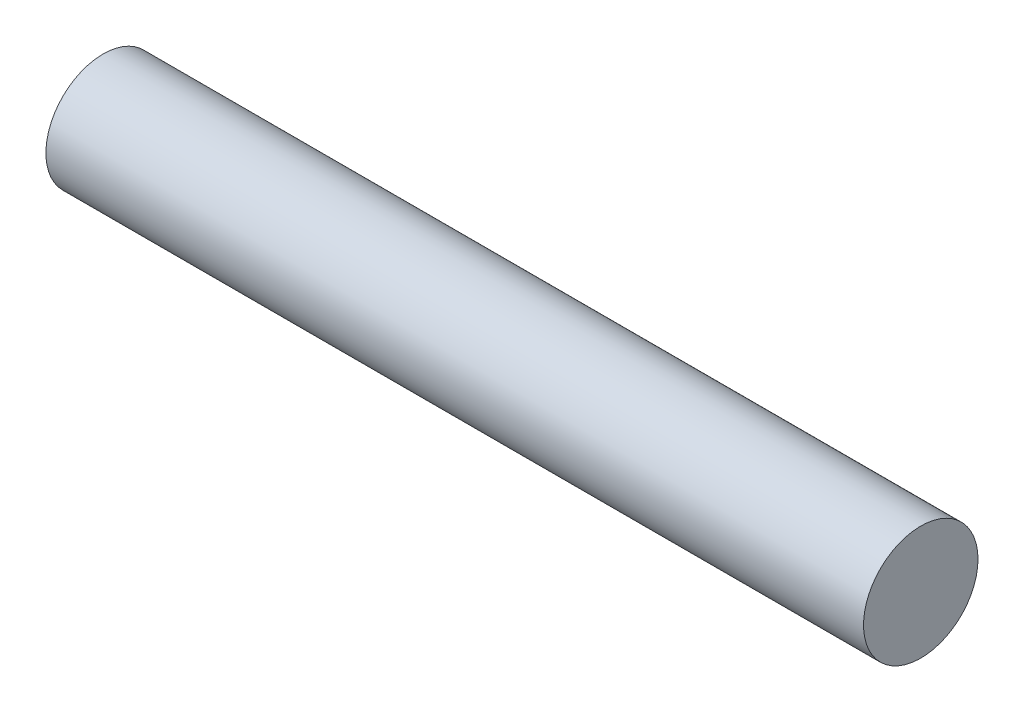
ISO-10303-21;
HEADER;
FILE_DESCRIPTION(('STEP AP214'),'2;1');
FILE_NAME('part.step','',(''),(''),'','','');
FILE_SCHEMA(('AUTOMOTIVE_DESIGN { 1 0 10303 214 1 1 1 1 }'));
ENDSEC;
DATA;
#1=APPLICATION_CONTEXT('core data for automotive mechanical design processes');
#2=APPLICATION_PROTOCOL_DEFINITION('international standard','automotive_design',2000,#1);
#3=PRODUCT_CONTEXT('',#1,'mechanical');
#4=PRODUCT('Part','Part','',(#3));
#5=PRODUCT_RELATED_PRODUCT_CATEGORY('part','',(#4));
#6=PRODUCT_DEFINITION_FORMATION('','',#4);
#7=PRODUCT_DEFINITION_CONTEXT('part definition',#1,'design');
#8=PRODUCT_DEFINITION('design','',#6,#7);
#9=PRODUCT_DEFINITION_SHAPE('','',#8);
#10=(LENGTH_UNIT() NAMED_UNIT(*) SI_UNIT(.MILLI.,.METRE.));
#11=(NAMED_UNIT(*) PLANE_ANGLE_UNIT() SI_UNIT($,.RADIAN.));
#12=(NAMED_UNIT(*) SI_UNIT($,.STERADIAN.) SOLID_ANGLE_UNIT());
#13=UNCERTAINTY_MEASURE_WITH_UNIT(LENGTH_MEASURE(1.E-05),#10,'distance_accuracy_value','');
#14=(GEOMETRIC_REPRESENTATION_CONTEXT(3) GLOBAL_UNCERTAINTY_ASSIGNED_CONTEXT((#13)) GLOBAL_UNIT_ASSIGNED_CONTEXT((#10,
#11,#12)) REPRESENTATION_CONTEXT('',''));
#15=CARTESIAN_POINT('',(0.,0.,0.));
#16=DIRECTION('',(0.,0.,1.));
#17=DIRECTION('',(1.,0.,0.));
#18=AXIS2_PLACEMENT_3D('',#15,#16,#17);
#19=CARTESIAN_POINT('',(25.,0.,0.));
#20=DIRECTION('',(-1.,0.,0.));
#21=DIRECTION('',(0.,0.,1.));
#22=AXIS2_PLACEMENT_3D('',#19,#20,#21);
#23=CYLINDRICAL_SURFACE('',#22,3.5);
#24=CARTESIAN_POINT('',(25.,0.,0.));
#25=DIRECTION('',(1.,0.,0.));
#26=DIRECTION('',(0.,0.,-1.));
#27=AXIS2_PLACEMENT_3D('',#24,#25,#26);
#28=CIRCLE('',#27,3.5);
#29=CARTESIAN_POINT('',(25.,0.,-3.5));
#30=VERTEX_POINT('',#29);
#31=EDGE_CURVE('E10',#30,#30,#28,.T.);
#32=ORIENTED_EDGE('',*,*,#31,.F.);
#33=EDGE_LOOP('',(#32));
#34=FACE_BOUND('',#33,.T.);
#35=CARTESIAN_POINT('',(-25.,0.,0.));
#36=DIRECTION('',(1.,0.,0.));
#37=DIRECTION('',(0.,0.,-1.));
#38=AXIS2_PLACEMENT_3D('',#35,#36,#37);
#39=CIRCLE('',#38,3.5);
#40=CARTESIAN_POINT('',(-25.,0.,-3.5));
#41=VERTEX_POINT('',#40);
#42=EDGE_CURVE('E39',#41,#41,#39,.T.);
#43=ORIENTED_EDGE('',*,*,#42,.T.);
#44=EDGE_LOOP('',(#43));
#45=FACE_BOUND('',#44,.T.);
#46=ADVANCED_FACE('F36',(#34,#45),#23,.T.);
#47=CARTESIAN_POINT('',(25.,0.,0.));
#48=DIRECTION('',(1.,0.,0.));
#49=DIRECTION('',(0.,0.,-1.));
#50=AXIS2_PLACEMENT_3D('',#47,#48,#49);
#51=PLANE('',#50);
#52=ORIENTED_EDGE('',*,*,#31,.T.);
#53=EDGE_LOOP('',(#52));
#54=FACE_BOUND('',#53,.T.);
#55=ADVANCED_FACE('F51',(#54),#51,.T.);
#56=CARTESIAN_POINT('',(-25.,0.,0.));
#57=DIRECTION('',(1.,0.,0.));
#58=DIRECTION('',(0.,0.,-1.));
#59=AXIS2_PLACEMENT_3D('',#56,#57,#58);
#60=PLANE('',#59);
#61=ORIENTED_EDGE('',*,*,#42,.F.);
#62=EDGE_LOOP('',(#61));
#63=FACE_BOUND('',#62,.T.);
#64=ADVANCED_FACE('F49',(#63),#60,.F.);
#65=CLOSED_SHELL('',(#46,#55,#64));
#66=MANIFOLD_SOLID_BREP('B2',#65);
#67=ADVANCED_BREP_SHAPE_REPRESENTATION('',(#18,#66),#14);
#68=SHAPE_DEFINITION_REPRESENTATION(#9,#67);
ENDSEC;
END-ISO-10303-21;
